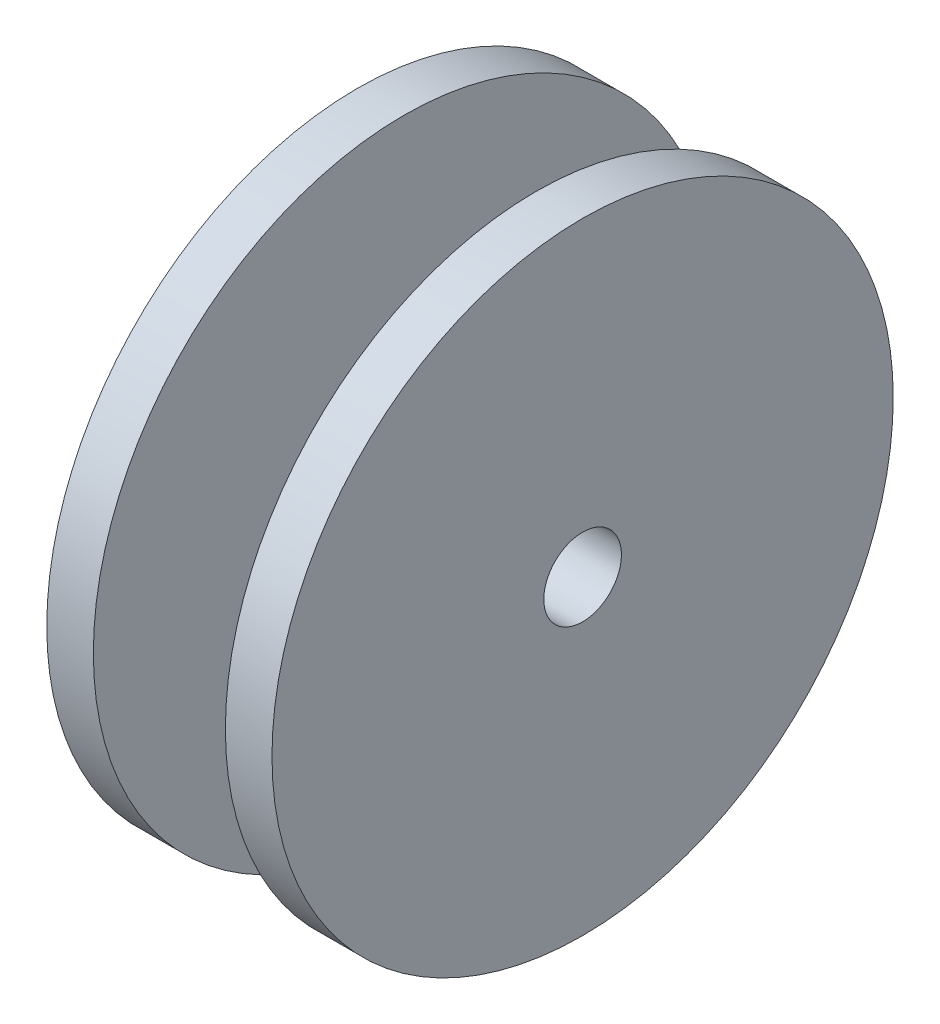
ISO-10303-21;
HEADER;
FILE_DESCRIPTION(('STEP AP214'),'2;1');
FILE_NAME('part.step','',(''),(''),'','','');
FILE_SCHEMA(('AUTOMOTIVE_DESIGN { 1 0 10303 214 1 1 1 1 }'));
ENDSEC;
DATA;
#1=APPLICATION_CONTEXT('core data for automotive mechanical design processes');
#2=APPLICATION_PROTOCOL_DEFINITION('international standard','automotive_design',2000,#1);
#3=PRODUCT_CONTEXT('',#1,'mechanical');
#4=PRODUCT('Part','Part','',(#3));
#5=PRODUCT_RELATED_PRODUCT_CATEGORY('part','',(#4));
#6=PRODUCT_DEFINITION_FORMATION('','',#4);
#7=PRODUCT_DEFINITION_CONTEXT('part definition',#1,'design');
#8=PRODUCT_DEFINITION('design','',#6,#7);
#9=PRODUCT_DEFINITION_SHAPE('','',#8);
#10=(LENGTH_UNIT() NAMED_UNIT(*) SI_UNIT(.MILLI.,.METRE.));
#11=(NAMED_UNIT(*) PLANE_ANGLE_UNIT() SI_UNIT($,.RADIAN.));
#12=(NAMED_UNIT(*) SI_UNIT($,.STERADIAN.) SOLID_ANGLE_UNIT());
#13=UNCERTAINTY_MEASURE_WITH_UNIT(LENGTH_MEASURE(1.E-05),#10,'distance_accuracy_value','');
#14=(GEOMETRIC_REPRESENTATION_CONTEXT(3) GLOBAL_UNCERTAINTY_ASSIGNED_CONTEXT((#13)) GLOBAL_UNIT_ASSIGNED_CONTEXT((#10,
#11,#12)) REPRESENTATION_CONTEXT('',''));
#15=CARTESIAN_POINT('',(0.,0.,0.));
#16=DIRECTION('',(0.,0.,1.));
#17=DIRECTION('',(1.,0.,0.));
#18=AXIS2_PLACEMENT_3D('',#15,#16,#17);
#19=CARTESIAN_POINT('',(7.25,0.,0.));
#20=DIRECTION('',(-1.,0.,0.));
#21=DIRECTION('',(0.,0.,1.));
#22=AXIS2_PLACEMENT_3D('',#19,#20,#21);
#23=CYLINDRICAL_SURFACE('',#22,20.);
#24=CARTESIAN_POINT('',(-7.25,0.,0.));
#25=DIRECTION('',(1.,0.,0.));
#26=DIRECTION('',(0.,0.,-1.));
#27=AXIS2_PLACEMENT_3D('',#24,#25,#26);
#28=CIRCLE('',#27,20.);
#29=CARTESIAN_POINT('',(-7.25,0.,20.));
#30=VERTEX_POINT('',#29);
#31=EDGE_CURVE('E49',#30,#30,#28,.T.);
#32=CARTESIAN_POINT('',(-4.25,0.,0.));
#33=DIRECTION('',(1.,0.,0.));
#34=DIRECTION('',(0.,0.,-1.));
#35=AXIS2_PLACEMENT_3D('',#32,#33,#34);
#36=CIRCLE('',#35,20.);
#37=CARTESIAN_POINT('',(-4.25,0.,20.));
#38=VERTEX_POINT('',#37);
#39=EDGE_CURVE('E55',#38,#38,#36,.T.);
#40=CARTESIAN_POINT('',(-7.25,0.,20.));
#41=CARTESIAN_POINT('',(-7.21875,0.,20.));
#42=CARTESIAN_POINT('',(-7.1875,0.,20.));
#43=CARTESIAN_POINT('',(-7.125,0.,20.));
#44=CARTESIAN_POINT('',(-7.09375,0.,20.));
#45=CARTESIAN_POINT('',(-7.03125,0.,20.));
#46=CARTESIAN_POINT('',(-7.,0.,20.));
#47=CARTESIAN_POINT('',(-6.9375,0.,20.));
#48=CARTESIAN_POINT('',(-6.90625,0.,20.));
#49=CARTESIAN_POINT('',(-6.84375,0.,20.));
#50=CARTESIAN_POINT('',(-6.8125,0.,20.));
#51=CARTESIAN_POINT('',(-6.75,0.,20.));
#52=CARTESIAN_POINT('',(-6.71875,0.,20.));
#53=CARTESIAN_POINT('',(-6.65625,0.,20.));
#54=CARTESIAN_POINT('',(-6.625,0.,20.));
#55=CARTESIAN_POINT('',(-6.5625,0.,20.));
#56=CARTESIAN_POINT('',(-6.53125,0.,20.));
#57=CARTESIAN_POINT('',(-6.46875,0.,20.));
#58=CARTESIAN_POINT('',(-6.4375,0.,20.));
#59=CARTESIAN_POINT('',(-6.375,0.,20.));
#60=CARTESIAN_POINT('',(-6.34375,0.,20.));
#61=CARTESIAN_POINT('',(-6.28125,0.,20.));
#62=CARTESIAN_POINT('',(-6.25,0.,20.));
#63=CARTESIAN_POINT('',(-6.1875,0.,20.));
#64=CARTESIAN_POINT('',(-6.15625,0.,20.));
#65=CARTESIAN_POINT('',(-6.09375,0.,20.));
#66=CARTESIAN_POINT('',(-6.0625,0.,20.));
#67=CARTESIAN_POINT('',(-6.,0.,20.));
#68=CARTESIAN_POINT('',(-5.96875,0.,20.));
#69=CARTESIAN_POINT('',(-5.90625,0.,20.));
#70=CARTESIAN_POINT('',(-5.875,0.,20.));
#71=CARTESIAN_POINT('',(-5.8125,0.,20.));
#72=CARTESIAN_POINT('',(-5.78125,0.,20.));
#73=CARTESIAN_POINT('',(-5.71875,0.,20.));
#74=CARTESIAN_POINT('',(-5.6875,0.,20.));
#75=CARTESIAN_POINT('',(-5.625,0.,20.));
#76=CARTESIAN_POINT('',(-5.59375,0.,20.));
#77=CARTESIAN_POINT('',(-5.53125,0.,20.));
#78=CARTESIAN_POINT('',(-5.5,0.,20.));
#79=CARTESIAN_POINT('',(-5.4375,0.,20.));
#80=CARTESIAN_POINT('',(-5.40625,0.,20.));
#81=CARTESIAN_POINT('',(-5.34375,0.,20.));
#82=CARTESIAN_POINT('',(-5.3125,0.,20.));
#83=CARTESIAN_POINT('',(-5.25,0.,20.));
#84=CARTESIAN_POINT('',(-5.21875,0.,20.));
#85=CARTESIAN_POINT('',(-5.15625,0.,20.));
#86=CARTESIAN_POINT('',(-5.125,0.,20.));
#87=CARTESIAN_POINT('',(-5.0625,0.,20.));
#88=CARTESIAN_POINT('',(-5.03125,0.,20.));
#89=CARTESIAN_POINT('',(-4.96875,0.,20.));
#90=CARTESIAN_POINT('',(-4.9375,0.,20.));
#91=CARTESIAN_POINT('',(-4.875,0.,20.));
#92=CARTESIAN_POINT('',(-4.84375,0.,20.));
#93=CARTESIAN_POINT('',(-4.78125,0.,20.));
#94=CARTESIAN_POINT('',(-4.75,0.,20.));
#95=CARTESIAN_POINT('',(-4.6875,0.,20.));
#96=CARTESIAN_POINT('',(-4.65625,0.,20.));
#97=CARTESIAN_POINT('',(-4.59375,0.,20.));
#98=CARTESIAN_POINT('',(-4.5625,0.,20.));
#99=CARTESIAN_POINT('',(-4.5,0.,20.));
#100=CARTESIAN_POINT('',(-4.46875,0.,20.));
#101=CARTESIAN_POINT('',(-4.40625,0.,20.));
#102=CARTESIAN_POINT('',(-4.375,0.,20.));
#103=CARTESIAN_POINT('',(-4.3125,0.,20.));
#104=CARTESIAN_POINT('',(-4.28125,0.,20.));
#105=CARTESIAN_POINT('',(-4.25,0.,20.));
#106=B_SPLINE_CURVE_WITH_KNOTS('',3,(#40,#41,#42,#43,#44,#45,#46,#47,#48,#49,#50,#51,#52,#53,
#54,#55,#56,#57,#58,#59,#60,#61,#62,#63,#64,#65,#66,#67,#68,#69,#70,#71,#72,#73,#74,#75,#76,#77,
#78,#79,#80,#81,#82,#83,#84,#85,#86,#87,#88,#89,#90,#91,#92,#93,#94,#95,#96,#97,#98,#99,#100,
#101,#102,#103,#104,#105),.UNSPECIFIED.,.F.,.F.,(4,2,2,2,2,2,2,2,2,2,2,2,2,2,2,2,2,2,2,2,2,2,2,
2,2,2,2,2,2,2,2,2,4),(0.,0.0937500000000001,0.1875,0.28125,0.375,0.46875,0.5625,
0.656250000000001,0.750000000000001,0.843749999999999,0.937499999999999,1.03125,1.125,1.21875,
1.3125,1.40625,1.5,1.59375,1.6875,1.78125,1.875,1.96875,2.0625,2.15625,2.25,2.34375,2.4375,
2.53125,2.625,2.71875,2.8125,2.90625,3.),.UNSPECIFIED.);
#107=EDGE_CURVE('BSEAM40',#30,#38,#106,.T.);
#108=ORIENTED_EDGE('',*,*,#31,.T.);
#109=ORIENTED_EDGE('',*,*,#39,.F.);
#110=ORIENTED_EDGE('',*,*,#107,.T.);
#111=ORIENTED_EDGE('',*,*,#107,.F.);
#112=EDGE_LOOP('',(#108,#110,#109,#111));
#113=FACE_BOUND('',#112,.T.);
#114=ADVANCED_FACE('F40',(#113),#23,.T.);
#115=CARTESIAN_POINT('',(-7.25,0.,0.));
#116=DIRECTION('',(1.,0.,0.));
#117=DIRECTION('',(0.,0.,-1.));
#118=AXIS2_PLACEMENT_3D('',#115,#116,#117);
#119=PLANE('',#118);
#120=CARTESIAN_POINT('',(-7.25,0.,0.));
#121=DIRECTION('',(1.,0.,0.));
#122=DIRECTION('',(0.,0.,-1.));
#123=AXIS2_PLACEMENT_3D('',#120,#121,#122);
#124=CIRCLE('',#123,2.5);
#125=CARTESIAN_POINT('',(-7.25,0.,-2.5));
#126=VERTEX_POINT('',#125);
#127=EDGE_CURVE('E72',#126,#126,#124,.T.);
#128=ORIENTED_EDGE('',*,*,#127,.T.);
#129=EDGE_LOOP('',(#128));
#130=FACE_BOUND('',#129,.T.);
#131=ORIENTED_EDGE('',*,*,#31,.F.);
#132=EDGE_LOOP('',(#131));
#133=FACE_BOUND('',#132,.T.);
#134=ADVANCED_FACE('F98',(#130,#133),#119,.F.);
#135=CARTESIAN_POINT('',(-4.25,0.,0.));
#136=DIRECTION('',(1.,0.,0.));
#137=DIRECTION('',(0.,0.,-1.));
#138=AXIS2_PLACEMENT_3D('',#135,#136,#137);
#139=PLANE('',#138);
#140=CARTESIAN_POINT('',(-4.25,0.,0.));
#141=DIRECTION('',(1.,0.,0.));
#142=DIRECTION('',(0.,0.,-1.));
#143=AXIS2_PLACEMENT_3D('',#140,#141,#142);
#144=CIRCLE('',#143,7.5);
#145=CARTESIAN_POINT('',(-4.25,0.,-7.5));
#146=VERTEX_POINT('',#145);
#147=EDGE_CURVE('E61',#146,#146,#144,.T.);
#148=ORIENTED_EDGE('',*,*,#147,.F.);
#149=EDGE_LOOP('',(#148));
#150=FACE_BOUND('',#149,.T.);
#151=ORIENTED_EDGE('',*,*,#39,.T.);
#152=EDGE_LOOP('',(#151));
#153=FACE_BOUND('',#152,.T.);
#154=ADVANCED_FACE('F103',(#150,#153),#139,.T.);
#155=CARTESIAN_POINT('',(4.25,0.,0.));
#156=DIRECTION('',(1.,0.,0.));
#157=DIRECTION('',(0.,0.,-1.));
#158=AXIS2_PLACEMENT_3D('',#155,#156,#157);
#159=PLANE('',#158);
#160=CARTESIAN_POINT('',(4.25,0.,0.));
#161=DIRECTION('',(1.,0.,0.));
#162=DIRECTION('',(0.,0.,-1.));
#163=AXIS2_PLACEMENT_3D('',#160,#161,#162);
#164=CIRCLE('',#163,7.5);
#165=CARTESIAN_POINT('',(4.25,0.,-7.5));
#166=VERTEX_POINT('',#165);
#167=EDGE_CURVE('E65',#166,#166,#164,.T.);
#168=ORIENTED_EDGE('',*,*,#167,.T.);
#169=EDGE_LOOP('',(#168));
#170=FACE_BOUND('',#169,.T.);
#171=CARTESIAN_POINT('',(4.25,0.,0.));
#172=DIRECTION('',(1.,0.,0.));
#173=DIRECTION('',(0.,0.,-1.));
#174=AXIS2_PLACEMENT_3D('',#171,#172,#173);
#175=CIRCLE('',#174,20.);
#176=CARTESIAN_POINT('',(4.25,0.,20.));
#177=VERTEX_POINT('',#176);
#178=EDGE_CURVE('E57',#177,#177,#175,.T.);
#179=ORIENTED_EDGE('',*,*,#178,.F.);
#180=EDGE_LOOP('',(#179));
#181=FACE_BOUND('',#180,.T.);
#182=ADVANCED_FACE('F93',(#170,#181),#159,.F.);
#183=CARTESIAN_POINT('',(-4.25,0.,0.));
#184=DIRECTION('',(1.,0.,0.));
#185=DIRECTION('',(0.,0.,-1.));
#186=AXIS2_PLACEMENT_3D('',#183,#184,#185);
#187=CYLINDRICAL_SURFACE('',#186,7.5);
#188=ORIENTED_EDGE('',*,*,#147,.T.);
#189=EDGE_LOOP('',(#188));
#190=FACE_BOUND('',#189,.T.);
#191=ORIENTED_EDGE('',*,*,#167,.F.);
#192=EDGE_LOOP('',(#191));
#193=FACE_BOUND('',#192,.T.);
#194=ADVANCED_FACE('F86',(#190,#193),#187,.T.);
#195=CARTESIAN_POINT('',(7.25,0.,0.));
#196=DIRECTION('',(1.,0.,0.));
#197=DIRECTION('',(0.,0.,-1.));
#198=AXIS2_PLACEMENT_3D('',#195,#196,#197);
#199=PLANE('',#198);
#200=CARTESIAN_POINT('',(7.25,0.,0.));
#201=DIRECTION('',(1.,0.,0.));
#202=DIRECTION('',(0.,0.,-1.));
#203=AXIS2_PLACEMENT_3D('',#200,#201,#202);
#204=CIRCLE('',#203,2.5);
#205=CARTESIAN_POINT('',(7.25,0.,-2.5));
#206=VERTEX_POINT('',#205);
#207=EDGE_CURVE('E44',#206,#206,#204,.T.);
#208=ORIENTED_EDGE('',*,*,#207,.F.);
#209=EDGE_LOOP('',(#208));
#210=FACE_BOUND('',#209,.T.);
#211=CARTESIAN_POINT('',(7.25,0.,0.));
#212=DIRECTION('',(1.,0.,0.));
#213=DIRECTION('',(0.,0.,-1.));
#214=AXIS2_PLACEMENT_3D('',#211,#212,#213);
#215=CIRCLE('',#214,20.);
#216=CARTESIAN_POINT('',(7.25,0.,20.));
#217=VERTEX_POINT('',#216);
#218=EDGE_CURVE('E10',#217,#217,#215,.T.);
#219=ORIENTED_EDGE('',*,*,#218,.T.);
#220=EDGE_LOOP('',(#219));
#221=FACE_BOUND('',#220,.T.);
#222=ADVANCED_FACE('F84',(#210,#221),#199,.T.);
#223=CARTESIAN_POINT('',(4.25,0.,20.));
#224=CARTESIAN_POINT('',(4.28125,0.,20.));
#225=CARTESIAN_POINT('',(4.3125,0.,20.));
#226=CARTESIAN_POINT('',(4.375,0.,20.));
#227=CARTESIAN_POINT('',(4.40625,0.,20.));
#228=CARTESIAN_POINT('',(4.46875,0.,20.));
#229=CARTESIAN_POINT('',(4.5,0.,20.));
#230=CARTESIAN_POINT('',(4.5625,0.,20.));
#231=CARTESIAN_POINT('',(4.59375,0.,20.));
#232=CARTESIAN_POINT('',(4.65625,0.,20.));
#233=CARTESIAN_POINT('',(4.6875,0.,20.));
#234=CARTESIAN_POINT('',(4.75,0.,20.));
#235=CARTESIAN_POINT('',(4.78125,0.,20.));
#236=CARTESIAN_POINT('',(4.84375,0.,20.));
#237=CARTESIAN_POINT('',(4.875,0.,20.));
#238=CARTESIAN_POINT('',(4.9375,0.,20.));
#239=CARTESIAN_POINT('',(4.96875,0.,20.));
#240=CARTESIAN_POINT('',(5.03125,0.,20.));
#241=CARTESIAN_POINT('',(5.0625,0.,20.));
#242=CARTESIAN_POINT('',(5.125,0.,20.));
#243=CARTESIAN_POINT('',(5.15625,0.,20.));
#244=CARTESIAN_POINT('',(5.21875,0.,20.));
#245=CARTESIAN_POINT('',(5.25,0.,20.));
#246=CARTESIAN_POINT('',(5.3125,0.,20.));
#247=CARTESIAN_POINT('',(5.34375,0.,20.));
#248=CARTESIAN_POINT('',(5.40625,0.,20.));
#249=CARTESIAN_POINT('',(5.4375,0.,20.));
#250=CARTESIAN_POINT('',(5.5,0.,20.));
#251=CARTESIAN_POINT('',(5.53125,0.,20.));
#252=CARTESIAN_POINT('',(5.59375,0.,20.));
#253=CARTESIAN_POINT('',(5.625,0.,20.));
#254=CARTESIAN_POINT('',(5.6875,0.,20.));
#255=CARTESIAN_POINT('',(5.71875,0.,20.));
#256=CARTESIAN_POINT('',(5.78125,0.,20.));
#257=CARTESIAN_POINT('',(5.8125,0.,20.));
#258=CARTESIAN_POINT('',(5.875,0.,20.));
#259=CARTESIAN_POINT('',(5.90625,0.,20.));
#260=CARTESIAN_POINT('',(5.96875,0.,20.));
#261=CARTESIAN_POINT('',(6.,0.,20.));
#262=CARTESIAN_POINT('',(6.0625,0.,20.));
#263=CARTESIAN_POINT('',(6.09375,0.,20.));
#264=CARTESIAN_POINT('',(6.15625,0.,20.));
#265=CARTESIAN_POINT('',(6.1875,0.,20.));
#266=CARTESIAN_POINT('',(6.25,0.,20.));
#267=CARTESIAN_POINT('',(6.28125,0.,20.));
#268=CARTESIAN_POINT('',(6.34375,0.,20.));
#269=CARTESIAN_POINT('',(6.375,0.,20.));
#270=CARTESIAN_POINT('',(6.4375,0.,20.));
#271=CARTESIAN_POINT('',(6.46875,0.,20.));
#272=CARTESIAN_POINT('',(6.53125,0.,20.));
#273=CARTESIAN_POINT('',(6.5625,0.,20.));
#274=CARTESIAN_POINT('',(6.625,0.,20.));
#275=CARTESIAN_POINT('',(6.65625,0.,20.));
#276=CARTESIAN_POINT('',(6.71875,0.,20.));
#277=CARTESIAN_POINT('',(6.75,0.,20.));
#278=CARTESIAN_POINT('',(6.8125,0.,20.));
#279=CARTESIAN_POINT('',(6.84375,0.,20.));
#280=CARTESIAN_POINT('',(6.90625,0.,20.));
#281=CARTESIAN_POINT('',(6.9375,0.,20.));
#282=CARTESIAN_POINT('',(7.,0.,20.));
#283=CARTESIAN_POINT('',(7.03125,0.,20.));
#284=CARTESIAN_POINT('',(7.09375,0.,20.));
#285=CARTESIAN_POINT('',(7.125,0.,20.));
#286=CARTESIAN_POINT('',(7.1875,0.,20.));
#287=CARTESIAN_POINT('',(7.21875,0.,20.));
#288=CARTESIAN_POINT('',(7.25,0.,20.));
#289=B_SPLINE_CURVE_WITH_KNOTS('',3,(#223,#224,#225,#226,#227,#228,#229,#230,#231,#232,#233,
#234,#235,#236,#237,#238,#239,#240,#241,#242,#243,#244,#245,#246,#247,#248,#249,#250,#251,#252,
#253,#254,#255,#256,#257,#258,#259,#260,#261,#262,#263,#264,#265,#266,#267,#268,#269,#270,#271,
#272,#273,#274,#275,#276,#277,#278,#279,#280,#281,#282,#283,#284,#285,#286,#287,#288),
.UNSPECIFIED.,.F.,.F.,(4,2,2,2,2,2,2,2,2,2,2,2,2,2,2,2,2,2,2,2,2,2,2,2,2,2,2,2,2,2,2,2,4),(0.,
0.0937500000000001,0.1875,0.28125,0.374999999999999,0.46875,0.5625,0.65625,0.75,
0.843749999999999,0.937499999999999,1.03125,1.125,1.21875,1.3125,1.40625,1.5,1.59375,1.6875,
1.78125,1.875,1.96875,2.0625,2.15625,2.25,2.34375,2.4375,2.53125,2.625,2.71875,2.8125,2.90625,
3.),.UNSPECIFIED.);
#290=EDGE_CURVE('BSEAM42',#177,#217,#289,.T.);
#291=ORIENTED_EDGE('',*,*,#178,.T.);
#292=ORIENTED_EDGE('',*,*,#218,.F.);
#293=ORIENTED_EDGE('',*,*,#290,.T.);
#294=ORIENTED_EDGE('',*,*,#290,.F.);
#295=EDGE_LOOP('',(#291,#293,#292,#294));
#296=FACE_BOUND('',#295,.T.);
#297=ADVANCED_FACE('F42',(#296),#23,.T.);
#298=CARTESIAN_POINT('',(-7.25,0.,0.));
#299=DIRECTION('',(1.,0.,0.));
#300=DIRECTION('',(0.,0.,-1.));
#301=AXIS2_PLACEMENT_3D('',#298,#299,#300);
#302=CYLINDRICAL_SURFACE('',#301,2.5);
#303=CARTESIAN_POINT('',(7.25,0.,-2.5));
#304=CARTESIAN_POINT('',(7.09895833333333,0.,-2.5));
#305=CARTESIAN_POINT('',(6.94791666666667,0.,-2.5));
#306=CARTESIAN_POINT('',(6.64583333333333,0.,-2.5));
#307=CARTESIAN_POINT('',(6.49479166666667,0.,-2.5));
#308=CARTESIAN_POINT('',(6.19270833333333,0.,-2.5));
#309=CARTESIAN_POINT('',(6.04166666666667,0.,-2.5));
#310=CARTESIAN_POINT('',(5.73958333333333,0.,-2.5));
#311=CARTESIAN_POINT('',(5.58854166666667,0.,-2.5));
#312=CARTESIAN_POINT('',(5.28645833333333,0.,-2.5));
#313=CARTESIAN_POINT('',(5.13541666666667,0.,-2.5));
#314=CARTESIAN_POINT('',(4.83333333333333,0.,-2.5));
#315=CARTESIAN_POINT('',(4.68229166666667,0.,-2.5));
#316=CARTESIAN_POINT('',(4.38020833333333,0.,-2.5));
#317=CARTESIAN_POINT('',(4.22916666666667,0.,-2.5));
#318=CARTESIAN_POINT('',(3.92708333333333,0.,-2.5));
#319=CARTESIAN_POINT('',(3.77604166666667,0.,-2.5));
#320=CARTESIAN_POINT('',(3.47395833333333,0.,-2.5));
#321=CARTESIAN_POINT('',(3.32291666666667,0.,-2.5));
#322=CARTESIAN_POINT('',(3.02083333333333,0.,-2.5));
#323=CARTESIAN_POINT('',(2.86979166666667,0.,-2.5));
#324=CARTESIAN_POINT('',(2.56770833333333,0.,-2.5));
#325=CARTESIAN_POINT('',(2.41666666666667,0.,-2.5));
#326=CARTESIAN_POINT('',(2.11458333333333,0.,-2.5));
#327=CARTESIAN_POINT('',(1.96354166666667,0.,-2.5));
#328=CARTESIAN_POINT('',(1.66145833333333,0.,-2.5));
#329=CARTESIAN_POINT('',(1.51041666666667,0.,-2.5));
#330=CARTESIAN_POINT('',(1.20833333333333,0.,-2.5));
#331=CARTESIAN_POINT('',(1.05729166666667,0.,-2.5));
#332=CARTESIAN_POINT('',(0.755208333333332,0.,-2.5));
#333=CARTESIAN_POINT('',(0.604166666666666,0.,-2.5));
#334=CARTESIAN_POINT('',(0.302083333333334,0.,-2.5));
#335=CARTESIAN_POINT('',(0.151041666666667,0.,-2.5));
#336=CARTESIAN_POINT('',(-0.151041666666667,0.,-2.5));
#337=CARTESIAN_POINT('',(-0.302083333333334,0.,-2.5));
#338=CARTESIAN_POINT('',(-0.604166666666667,0.,-2.5));
#339=CARTESIAN_POINT('',(-0.755208333333334,0.,-2.5));
#340=CARTESIAN_POINT('',(-1.05729166666667,0.,-2.5));
#341=CARTESIAN_POINT('',(-1.20833333333333,0.,-2.5));
#342=CARTESIAN_POINT('',(-1.51041666666667,0.,-2.5));
#343=CARTESIAN_POINT('',(-1.66145833333333,0.,-2.5));
#344=CARTESIAN_POINT('',(-1.96354166666667,0.,-2.5));
#345=CARTESIAN_POINT('',(-2.11458333333333,0.,-2.5));
#346=CARTESIAN_POINT('',(-2.41666666666667,0.,-2.5));
#347=CARTESIAN_POINT('',(-2.56770833333333,0.,-2.5));
#348=CARTESIAN_POINT('',(-2.86979166666667,0.,-2.5));
#349=CARTESIAN_POINT('',(-3.02083333333333,0.,-2.5));
#350=CARTESIAN_POINT('',(-3.32291666666667,0.,-2.5));
#351=CARTESIAN_POINT('',(-3.47395833333333,0.,-2.5));
#352=CARTESIAN_POINT('',(-3.77604166666667,0.,-2.5));
#353=CARTESIAN_POINT('',(-3.92708333333333,0.,-2.5));
#354=CARTESIAN_POINT('',(-4.22916666666667,0.,-2.5));
#355=CARTESIAN_POINT('',(-4.38020833333333,0.,-2.5));
#356=CARTESIAN_POINT('',(-4.68229166666667,0.,-2.5));
#357=CARTESIAN_POINT('',(-4.83333333333333,0.,-2.5));
#358=CARTESIAN_POINT('',(-5.13541666666667,0.,-2.5));
#359=CARTESIAN_POINT('',(-5.28645833333333,0.,-2.5));
#360=CARTESIAN_POINT('',(-5.58854166666667,0.,-2.5));
#361=CARTESIAN_POINT('',(-5.73958333333333,0.,-2.5));
#362=CARTESIAN_POINT('',(-6.04166666666667,0.,-2.5));
#363=CARTESIAN_POINT('',(-6.19270833333333,0.,-2.5));
#364=CARTESIAN_POINT('',(-6.49479166666667,0.,-2.5));
#365=CARTESIAN_POINT('',(-6.64583333333333,0.,-2.5));
#366=CARTESIAN_POINT('',(-6.94791666666667,0.,-2.5));
#367=CARTESIAN_POINT('',(-7.09895833333333,0.,-2.5));
#368=CARTESIAN_POINT('',(-7.25,0.,-2.5));
#369=B_SPLINE_CURVE_WITH_KNOTS('',3,(#303,#304,#305,#306,#307,#308,#309,#310,#311,#312,#313,
#314,#315,#316,#317,#318,#319,#320,#321,#322,#323,#324,#325,#326,#327,#328,#329,#330,#331,#332,
#333,#334,#335,#336,#337,#338,#339,#340,#341,#342,#343,#344,#345,#346,#347,#348,#349,#350,#351,
#352,#353,#354,#355,#356,#357,#358,#359,#360,#361,#362,#363,#364,#365,#366,#367,#368),
.UNSPECIFIED.,.F.,.F.,(4,2,2,2,2,2,2,2,2,2,2,2,2,2,2,2,2,2,2,2,2,2,2,2,2,2,2,2,2,2,2,2,4),(0.,
0.453125,0.906250000000001,1.359375,1.8125,2.265625,2.71875,3.171875,3.625,4.078125,4.53125,
4.984375,5.4375,5.890625,6.34375,6.796875,7.25,7.703125,8.15625,8.609375,9.0625,9.515625,
9.96875,10.421875,10.875,11.328125,11.78125,12.234375,12.6875,13.140625,13.59375,14.046875,
14.5),.UNSPECIFIED.);
#370=EDGE_CURVE('BSEAM81',#206,#126,#369,.T.);
#371=ORIENTED_EDGE('',*,*,#207,.T.);
#372=ORIENTED_EDGE('',*,*,#127,.F.);
#373=ORIENTED_EDGE('',*,*,#370,.T.);
#374=ORIENTED_EDGE('',*,*,#370,.F.);
#375=EDGE_LOOP('',(#371,#373,#372,#374));
#376=FACE_BOUND('',#375,.T.);
#377=ADVANCED_FACE('F81',(#376),#302,.F.);
#378=CLOSED_SHELL('',(#114,#134,#154,#182,#194,#222,#297,#377));
#379=MANIFOLD_SOLID_BREP('B2',#378);
#380=ADVANCED_BREP_SHAPE_REPRESENTATION('',(#18,#379),#14);
#381=SHAPE_DEFINITION_REPRESENTATION(#9,#380);
ENDSEC;
END-ISO-10303-21;
